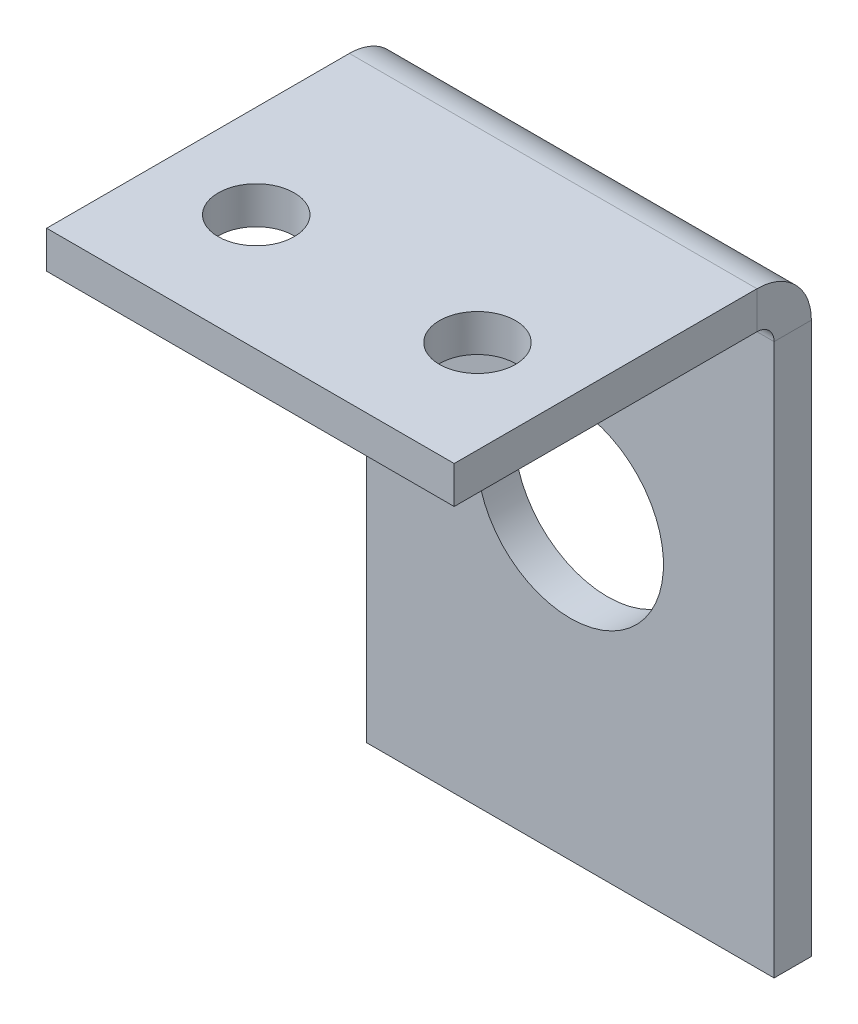
ISO-10303-21;
HEADER;
FILE_DESCRIPTION(('STEP AP214'),'2;1');
FILE_NAME('part.step','',(''),(''),'','','');
FILE_SCHEMA(('AUTOMOTIVE_DESIGN { 1 0 10303 214 1 1 1 1 }'));
ENDSEC;
DATA;
#1=APPLICATION_CONTEXT('core data for automotive mechanical design processes');
#2=APPLICATION_PROTOCOL_DEFINITION('international standard','automotive_design',2000,#1);
#3=PRODUCT_CONTEXT('',#1,'mechanical');
#4=PRODUCT('Part','Part','',(#3));
#5=PRODUCT_RELATED_PRODUCT_CATEGORY('part','',(#4));
#6=PRODUCT_DEFINITION_FORMATION('','',#4);
#7=PRODUCT_DEFINITION_CONTEXT('part definition',#1,'design');
#8=PRODUCT_DEFINITION('design','',#6,#7);
#9=PRODUCT_DEFINITION_SHAPE('','',#8);
#10=(LENGTH_UNIT() NAMED_UNIT(*) SI_UNIT(.MILLI.,.METRE.));
#11=(NAMED_UNIT(*) PLANE_ANGLE_UNIT() SI_UNIT($,.RADIAN.));
#12=(NAMED_UNIT(*) SI_UNIT($,.STERADIAN.) SOLID_ANGLE_UNIT());
#13=UNCERTAINTY_MEASURE_WITH_UNIT(LENGTH_MEASURE(1.E-05),#10,'distance_accuracy_value','');
#14=(GEOMETRIC_REPRESENTATION_CONTEXT(3) GLOBAL_UNCERTAINTY_ASSIGNED_CONTEXT((#13)) GLOBAL_UNIT_ASSIGNED_CONTEXT((#10,
#11,#12)) REPRESENTATION_CONTEXT('',''));
#15=CARTESIAN_POINT('',(0.,0.,0.));
#16=DIRECTION('',(0.,0.,1.));
#17=DIRECTION('',(1.,0.,0.));
#18=AXIS2_PLACEMENT_3D('',#15,#16,#17);
#19=CARTESIAN_POINT('',(0.,0.,0.));
#20=DIRECTION('',(0.,1.,0.));
#21=DIRECTION('',(0.,0.,1.));
#22=AXIS2_PLACEMENT_3D('',#19,#20,#21);
#23=PLANE('',#22);
#24=CARTESIAN_POINT('',(-19.2867132867133,0.,-16.3298368298368));
#25=DIRECTION('',(0.,1.,0.));
#26=DIRECTION('',(0.,0.,1.));
#27=AXIS2_PLACEMENT_3D('',#24,#25,#26);
#28=CIRCLE('',#27,1.63195);
#29=CARTESIAN_POINT('',(-19.2867132867133,0.,-14.6978868298368));
#30=VERTEX_POINT('',#29);
#31=EDGE_CURVE('E222',#30,#30,#28,.F.);
#32=ORIENTED_EDGE('',*,*,#31,.T.);
#33=EDGE_LOOP('',(#32));
#34=FACE_BOUND('',#33,.T.);
#35=DIRECTION('',(0.,0.,1.));
#36=VECTOR('',#35,1.);
#37=CARTESIAN_POINT('',(-23.2867132867133,0.,-21.3298368298368));
#38=LINE('',#37,#36);
#39=CARTESIAN_POINT('',(-23.2867132867133,0.,-24.3298368298368));
#40=VERTEX_POINT('',#39);
#41=CARTESIAN_POINT('',(-23.2867132867133,0.,-11.3298368298368));
#42=VERTEX_POINT('',#41);
#43=EDGE_CURVE('E234',#40,#42,#38,.T.);
#44=ORIENTED_EDGE('',*,*,#43,.T.);
#45=DIRECTION('',(1.,0.,0.));
#46=VECTOR('',#45,1.);
#47=CARTESIAN_POINT('',(-23.2867132867133,0.,-11.3298368298368));
#48=LINE('',#47,#46);
#49=CARTESIAN_POINT('',(-5.78671328671329,0.,-11.3298368298368));
#50=VERTEX_POINT('',#49);
#51=EDGE_CURVE('E249',#42,#50,#48,.T.);
#52=ORIENTED_EDGE('',*,*,#51,.T.);
#53=DIRECTION('',(0.,0.,-1.));
#54=VECTOR('',#53,1.);
#55=CARTESIAN_POINT('',(-5.78671328671329,0.,-21.3298368298368));
#56=LINE('',#55,#54);
#57=CARTESIAN_POINT('',(-5.78671328671329,0.,-24.3298368298368));
#58=VERTEX_POINT('',#57);
#59=EDGE_CURVE('E239',#50,#58,#56,.T.);
#60=ORIENTED_EDGE('',*,*,#59,.T.);
#61=DIRECTION('',(1.,0.,0.));
#62=VECTOR('',#61,1.);
#63=CARTESIAN_POINT('',(-5.78671328671329,0.,-24.3298368298368));
#64=LINE('',#63,#62);
#65=EDGE_CURVE('E192',#58,#40,#64,.F.);
#66=ORIENTED_EDGE('',*,*,#65,.T.);
#67=EDGE_LOOP('',(#44,#52,#60,#66));
#68=FACE_BOUND('',#67,.T.);
#69=CARTESIAN_POINT('',(-9.78671328671328,0.,-16.3298368298368));
#70=DIRECTION('',(0.,1.,0.));
#71=DIRECTION('',(0.,0.,1.));
#72=AXIS2_PLACEMENT_3D('',#69,#70,#71);
#73=CIRCLE('',#72,1.63195);
#74=CARTESIAN_POINT('',(-9.78671328671328,0.,-14.6978868298368));
#75=VERTEX_POINT('',#74);
#76=EDGE_CURVE('E230',#75,#75,#73,.F.);
#77=ORIENTED_EDGE('',*,*,#76,.T.);
#78=EDGE_LOOP('',(#77));
#79=FACE_BOUND('',#78,.T.);
#80=ADVANCED_FACE('F67',(#34,#68,#79),#23,.T.);
#81=CARTESIAN_POINT('',(0.,-1.6,0.));
#82=DIRECTION('',(0.,1.,0.));
#83=DIRECTION('',(0.,0.,1.));
#84=AXIS2_PLACEMENT_3D('',#81,#82,#83);
#85=PLANE('',#84);
#86=CARTESIAN_POINT('',(-19.2867132867133,-1.6,-16.3298368298368));
#87=DIRECTION('',(0.,-1.,0.));
#88=DIRECTION('',(0.,0.,-1.));
#89=AXIS2_PLACEMENT_3D('',#86,#87,#88);
#90=CIRCLE('',#89,1.63195);
#91=CARTESIAN_POINT('',(-19.2867132867133,-1.6,-17.9617868298368));
#92=VERTEX_POINT('',#91);
#93=EDGE_CURVE('E215',#92,#92,#90,.T.);
#94=ORIENTED_EDGE('',*,*,#93,.F.);
#95=EDGE_LOOP('',(#94));
#96=FACE_BOUND('',#95,.T.);
#97=DIRECTION('',(0.,0.,1.));
#98=VECTOR('',#97,1.);
#99=CARTESIAN_POINT('',(-23.2867132867133,-1.6,-21.3298368298368));
#100=LINE('',#99,#98);
#101=CARTESIAN_POINT('',(-23.2867132867133,-1.6,-24.3298368298368));
#102=VERTEX_POINT('',#101);
#103=CARTESIAN_POINT('',(-23.2867132867133,-1.6,-11.3298368298368));
#104=VERTEX_POINT('',#103);
#105=EDGE_CURVE('E235',#102,#104,#100,.T.);
#106=ORIENTED_EDGE('',*,*,#105,.F.);
#107=DIRECTION('',(1.,0.,0.));
#108=VECTOR('',#107,1.);
#109=CARTESIAN_POINT('',(-5.78671328671329,-1.6,-24.3298368298368));
#110=LINE('',#109,#108);
#111=CARTESIAN_POINT('',(-5.78671328671329,-1.6,-24.3298368298368));
#112=VERTEX_POINT('',#111);
#113=EDGE_CURVE('E205',#112,#102,#110,.F.);
#114=ORIENTED_EDGE('',*,*,#113,.F.);
#115=DIRECTION('',(0.,0.,-1.));
#116=VECTOR('',#115,1.);
#117=CARTESIAN_POINT('',(-5.78671328671329,-1.6,-21.3298368298368));
#118=LINE('',#117,#116);
#119=CARTESIAN_POINT('',(-5.78671328671329,-1.6,-11.3298368298368));
#120=VERTEX_POINT('',#119);
#121=EDGE_CURVE('E243',#120,#112,#118,.T.);
#122=ORIENTED_EDGE('',*,*,#121,.F.);
#123=DIRECTION('',(1.,0.,0.));
#124=VECTOR('',#123,1.);
#125=CARTESIAN_POINT('',(-23.2867132867133,-1.6,-11.3298368298368));
#126=LINE('',#125,#124);
#127=EDGE_CURVE('E238',#104,#120,#126,.T.);
#128=ORIENTED_EDGE('',*,*,#127,.F.);
#129=EDGE_LOOP('',(#106,#114,#122,#128));
#130=FACE_BOUND('',#129,.T.);
#131=CARTESIAN_POINT('',(-9.78671328671328,-1.6,-16.3298368298368));
#132=DIRECTION('',(0.,-1.,0.));
#133=DIRECTION('',(0.,0.,-1.));
#134=AXIS2_PLACEMENT_3D('',#131,#132,#133);
#135=CIRCLE('',#134,1.63195);
#136=CARTESIAN_POINT('',(-9.78671328671328,-1.6,-17.9617868298368));
#137=VERTEX_POINT('',#136);
#138=EDGE_CURVE('E226',#137,#137,#135,.T.);
#139=ORIENTED_EDGE('',*,*,#138,.F.);
#140=EDGE_LOOP('',(#139));
#141=FACE_BOUND('',#140,.T.);
#142=ADVANCED_FACE('F278',(#96,#130,#141),#85,.F.);
#143=CARTESIAN_POINT('',(-23.2867132867133,-1.6,-21.3298368298368));
#144=DIRECTION('',(-1.,0.,0.));
#145=DIRECTION('',(0.,0.,1.));
#146=AXIS2_PLACEMENT_3D('',#143,#144,#145);
#147=PLANE('',#146);
#148=ORIENTED_EDGE('',*,*,#43,.F.);
#149=DIRECTION('',(0.,1.,0.));
#150=VECTOR('',#149,1.);
#151=CARTESIAN_POINT('',(-23.2867132867133,-1.6,-24.3298368298368));
#152=LINE('',#151,#150);
#153=EDGE_CURVE('E212',#102,#40,#152,.T.);
#154=ORIENTED_EDGE('',*,*,#153,.F.);
#155=ORIENTED_EDGE('',*,*,#105,.T.);
#156=DIRECTION('',(0.,1.,0.));
#157=VECTOR('',#156,1.);
#158=CARTESIAN_POINT('',(-23.2867132867133,-1.6,-11.3298368298368));
#159=LINE('',#158,#157);
#160=EDGE_CURVE('E71',#104,#42,#159,.T.);
#161=ORIENTED_EDGE('',*,*,#160,.T.);
#162=EDGE_LOOP('',(#148,#154,#155,#161));
#163=FACE_BOUND('',#162,.T.);
#164=ADVANCED_FACE('F69',(#163),#147,.T.);
#165=CARTESIAN_POINT('',(-5.78671328671329,-1.6,-21.3298368298368));
#166=DIRECTION('',(1.,0.,0.));
#167=DIRECTION('',(0.,0.,-1.));
#168=AXIS2_PLACEMENT_3D('',#165,#166,#167);
#169=PLANE('',#168);
#170=ORIENTED_EDGE('',*,*,#59,.F.);
#171=DIRECTION('',(0.,1.,0.));
#172=VECTOR('',#171,1.);
#173=CARTESIAN_POINT('',(-5.78671328671329,-1.6,-11.3298368298368));
#174=LINE('',#173,#172);
#175=EDGE_CURVE('E13',#120,#50,#174,.T.);
#176=ORIENTED_EDGE('',*,*,#175,.F.);
#177=ORIENTED_EDGE('',*,*,#121,.T.);
#178=DIRECTION('',(0.,1.,0.));
#179=VECTOR('',#178,1.);
#180=CARTESIAN_POINT('',(-5.78671328671329,-1.6,-24.3298368298368));
#181=LINE('',#180,#179);
#182=EDGE_CURVE('E198',#112,#58,#181,.T.);
#183=ORIENTED_EDGE('',*,*,#182,.T.);
#184=EDGE_LOOP('',(#170,#176,#177,#183));
#185=FACE_BOUND('',#184,.T.);
#186=ADVANCED_FACE('F257',(#185),#169,.T.);
#187=CARTESIAN_POINT('',(-23.2867132867133,-1.6,-11.3298368298368));
#188=DIRECTION('',(0.,0.,1.));
#189=DIRECTION('',(1.,0.,0.));
#190=AXIS2_PLACEMENT_3D('',#187,#188,#189);
#191=PLANE('',#190);
#192=ORIENTED_EDGE('',*,*,#51,.F.);
#193=ORIENTED_EDGE('',*,*,#160,.F.);
#194=ORIENTED_EDGE('',*,*,#127,.T.);
#195=ORIENTED_EDGE('',*,*,#175,.T.);
#196=EDGE_LOOP('',(#192,#193,#194,#195));
#197=FACE_BOUND('',#196,.T.);
#198=ADVANCED_FACE('F282',(#197),#191,.T.);
#199=CARTESIAN_POINT('',(-9.78671328671328,-1.6,-16.3298368298368));
#200=DIRECTION('',(0.,-1.,0.));
#201=DIRECTION('',(0.,0.,-1.));
#202=AXIS2_PLACEMENT_3D('',#199,#200,#201);
#203=CYLINDRICAL_SURFACE('',#202,1.63195);
#204=ORIENTED_EDGE('',*,*,#76,.F.);
#205=EDGE_LOOP('',(#204));
#206=FACE_BOUND('',#205,.T.);
#207=ORIENTED_EDGE('',*,*,#138,.T.);
#208=EDGE_LOOP('',(#207));
#209=FACE_BOUND('',#208,.T.);
#210=ADVANCED_FACE('F292',(#206,#209),#203,.F.);
#211=CARTESIAN_POINT('',(-19.2867132867133,-1.6,-16.3298368298368));
#212=DIRECTION('',(0.,-1.,0.));
#213=DIRECTION('',(0.,0.,-1.));
#214=AXIS2_PLACEMENT_3D('',#211,#212,#213);
#215=CYLINDRICAL_SURFACE('',#214,1.63195);
#216=ORIENTED_EDGE('',*,*,#31,.F.);
#217=EDGE_LOOP('',(#216));
#218=FACE_BOUND('',#217,.T.);
#219=ORIENTED_EDGE('',*,*,#93,.T.);
#220=EDGE_LOOP('',(#219));
#221=FACE_BOUND('',#220,.T.);
#222=ADVANCED_FACE('F296',(#218,#221),#215,.F.);
#223=CARTESIAN_POINT('',(-23.2867132867133,-2.3366,-24.3298368298368));
#224=DIRECTION('',(-1.,0.,0.));
#225=DIRECTION('',(0.,0.,1.));
#226=AXIS2_PLACEMENT_3D('',#223,#224,#225);
#227=PLANE('',#226);
#228=DIRECTION('',(0.,0.,1.));
#229=VECTOR('',#228,1.);
#230=CARTESIAN_POINT('',(-23.2867132867133,-2.33659999999999,-26.6664368298368));
#231=LINE('',#230,#229);
#232=CARTESIAN_POINT('',(-23.2867132867133,-2.3366,-25.0664368298368));
#233=VERTEX_POINT('',#232);
#234=CARTESIAN_POINT('',(-23.2867132867133,-2.33659999999999,-26.6664368298368));
#235=VERTEX_POINT('',#234);
#236=EDGE_CURVE('E162',#233,#235,#231,.F.);
#237=ORIENTED_EDGE('',*,*,#236,.F.);
#238=CARTESIAN_POINT('',(-23.2867132867133,-2.3366,-24.3298368298368));
#239=DIRECTION('',(1.,0.,0.));
#240=DIRECTION('',(0.,0.,-1.));
#241=AXIS2_PLACEMENT_3D('',#238,#239,#240);
#242=CIRCLE('',#241,0.7366);
#243=EDGE_CURVE('E202',#102,#233,#242,.F.);
#244=ORIENTED_EDGE('',*,*,#243,.F.);
#245=ORIENTED_EDGE('',*,*,#153,.T.);
#246=CARTESIAN_POINT('',(-23.2867132867133,-2.3366,-24.3298368298368));
#247=DIRECTION('',(1.,0.,0.));
#248=DIRECTION('',(0.,0.,-1.));
#249=AXIS2_PLACEMENT_3D('',#246,#247,#248);
#250=CIRCLE('',#249,2.3366);
#251=EDGE_CURVE('E101',#40,#235,#250,.F.);
#252=ORIENTED_EDGE('',*,*,#251,.T.);
#253=EDGE_LOOP('',(#237,#244,#245,#252));
#254=FACE_BOUND('',#253,.T.);
#255=ADVANCED_FACE('F274',(#254),#227,.T.);
#256=CARTESIAN_POINT('',(-5.78671328671329,-2.3366,-24.3298368298368));
#257=DIRECTION('',(-1.,0.,0.));
#258=DIRECTION('',(0.,0.,1.));
#259=AXIS2_PLACEMENT_3D('',#256,#257,#258);
#260=PLANE('',#259);
#261=CARTESIAN_POINT('',(-5.78671328671329,-2.3366,-24.3298368298368));
#262=DIRECTION('',(1.,0.,0.));
#263=DIRECTION('',(0.,0.,-1.));
#264=AXIS2_PLACEMENT_3D('',#261,#262,#263);
#265=CIRCLE('',#264,0.7366);
#266=CARTESIAN_POINT('',(-5.78671328671329,-2.3366,-25.0664368298368));
#267=VERTEX_POINT('',#266);
#268=EDGE_CURVE('E208',#267,#112,#265,.T.);
#269=ORIENTED_EDGE('',*,*,#268,.F.);
#270=DIRECTION('',(0.,0.,1.));
#271=VECTOR('',#270,1.);
#272=CARTESIAN_POINT('',(-5.78671328671329,-2.3366,-25.0664368298368));
#273=LINE('',#272,#271);
#274=CARTESIAN_POINT('',(-5.78671328671329,-2.33659999999999,-26.6664368298368));
#275=VERTEX_POINT('',#274);
#276=EDGE_CURVE('E182',#267,#275,#273,.F.);
#277=ORIENTED_EDGE('',*,*,#276,.T.);
#278=CARTESIAN_POINT('',(-5.78671328671329,-2.3366,-24.3298368298368));
#279=DIRECTION('',(1.,0.,0.));
#280=DIRECTION('',(0.,0.,-1.));
#281=AXIS2_PLACEMENT_3D('',#278,#279,#280);
#282=CIRCLE('',#281,2.3366);
#283=EDGE_CURVE('E195',#275,#58,#282,.T.);
#284=ORIENTED_EDGE('',*,*,#283,.T.);
#285=ORIENTED_EDGE('',*,*,#182,.F.);
#286=EDGE_LOOP('',(#269,#277,#284,#285));
#287=FACE_BOUND('',#286,.T.);
#288=ADVANCED_FACE('F261',(#287),#260,.F.);
#289=CARTESIAN_POINT('',(-5.78671328671329,-2.3366,-24.3298368298368));
#290=DIRECTION('',(1.,0.,0.));
#291=DIRECTION('',(0.,0.,-1.));
#292=AXIS2_PLACEMENT_3D('',#289,#290,#291);
#293=CYLINDRICAL_SURFACE('',#292,2.3366);
#294=ORIENTED_EDGE('',*,*,#65,.F.);
#295=ORIENTED_EDGE('',*,*,#283,.F.);
#296=DIRECTION('',(1.,0.,0.));
#297=VECTOR('',#296,1.);
#298=CARTESIAN_POINT('',(-23.2867132867133,-2.33659999999999,-26.6664368298368));
#299=LINE('',#298,#297);
#300=EDGE_CURVE('E179',#275,#235,#299,.F.);
#301=ORIENTED_EDGE('',*,*,#300,.T.);
#302=ORIENTED_EDGE('',*,*,#251,.F.);
#303=EDGE_LOOP('',(#294,#295,#301,#302));
#304=FACE_BOUND('',#303,.T.);
#305=ADVANCED_FACE('F272',(#304),#293,.T.);
#306=CARTESIAN_POINT('',(-5.78671328671329,-2.3366,-24.3298368298368));
#307=DIRECTION('',(1.,0.,0.));
#308=DIRECTION('',(0.,0.,-1.));
#309=AXIS2_PLACEMENT_3D('',#306,#307,#308);
#310=CYLINDRICAL_SURFACE('',#309,0.7366);
#311=ORIENTED_EDGE('',*,*,#113,.T.);
#312=ORIENTED_EDGE('',*,*,#243,.T.);
#313=DIRECTION('',(1.,0.,0.));
#314=VECTOR('',#313,1.);
#315=CARTESIAN_POINT('',(-23.2867132867133,-2.3366,-25.0664368298368));
#316=LINE('',#315,#314);
#317=EDGE_CURVE('E186',#233,#267,#316,.T.);
#318=ORIENTED_EDGE('',*,*,#317,.T.);
#319=ORIENTED_EDGE('',*,*,#268,.T.);
#320=EDGE_LOOP('',(#311,#312,#318,#319));
#321=FACE_BOUND('',#320,.T.);
#322=ADVANCED_FACE('F264',(#321),#310,.F.);
#323=CARTESIAN_POINT('',(-5.78671328671329,-26.,-26.6664368298369));
#324=DIRECTION('',(-1.,0.,0.));
#325=DIRECTION('',(0.,0.,1.));
#326=AXIS2_PLACEMENT_3D('',#323,#324,#325);
#327=PLANE('',#326);
#328=ORIENTED_EDGE('',*,*,#276,.F.);
#329=DIRECTION('',(0.,1.,0.));
#330=VECTOR('',#329,1.);
#331=CARTESIAN_POINT('',(-5.78671328671329,-26.,-25.0664368298369));
#332=LINE('',#331,#330);
#333=CARTESIAN_POINT('',(-5.78671328671329,-26.,-25.0664368298369));
#334=VERTEX_POINT('',#333);
#335=EDGE_CURVE('E176',#267,#334,#332,.F.);
#336=ORIENTED_EDGE('',*,*,#335,.T.);
#337=DIRECTION('',(0.,0.,1.));
#338=VECTOR('',#337,1.);
#339=CARTESIAN_POINT('',(-5.78671328671329,-26.,-26.6664368298369));
#340=LINE('',#339,#338);
#341=CARTESIAN_POINT('',(-5.78671328671329,-26.,-26.6664368298369));
#342=VERTEX_POINT('',#341);
#343=EDGE_CURVE('E158',#342,#334,#340,.T.);
#344=ORIENTED_EDGE('',*,*,#343,.F.);
#345=DIRECTION('',(0.,-1.,0.));
#346=VECTOR('',#345,1.);
#347=CARTESIAN_POINT('',(-5.78671328671329,0.,-26.6664368298368));
#348=LINE('',#347,#346);
#349=EDGE_CURVE('E143',#275,#342,#348,.T.);
#350=ORIENTED_EDGE('',*,*,#349,.F.);
#351=EDGE_LOOP('',(#328,#336,#344,#350));
#352=FACE_BOUND('',#351,.T.);
#353=ADVANCED_FACE('F271',(#352),#327,.F.);
#354=CARTESIAN_POINT('',(-23.2867132867133,-1.59999999999999,-26.6664368298368));
#355=DIRECTION('',(1.,0.,0.));
#356=DIRECTION('',(0.,0.,-1.));
#357=AXIS2_PLACEMENT_3D('',#354,#355,#356);
#358=PLANE('',#357);
#359=ORIENTED_EDGE('',*,*,#236,.T.);
#360=DIRECTION('',(0.,1.,0.));
#361=VECTOR('',#360,1.);
#362=CARTESIAN_POINT('',(-23.2867132867133,0.,-26.6664368298368));
#363=LINE('',#362,#361);
#364=CARTESIAN_POINT('',(-23.2867132867133,-26.,-26.6664368298369));
#365=VERTEX_POINT('',#364);
#366=EDGE_CURVE('E141',#365,#235,#363,.T.);
#367=ORIENTED_EDGE('',*,*,#366,.F.);
#368=DIRECTION('',(0.,0.,1.));
#369=VECTOR('',#368,1.);
#370=CARTESIAN_POINT('',(-23.2867132867133,-26.,-26.6664368298369));
#371=LINE('',#370,#369);
#372=CARTESIAN_POINT('',(-23.2867132867133,-26.,-25.0664368298369));
#373=VERTEX_POINT('',#372);
#374=EDGE_CURVE('E150',#365,#373,#371,.T.);
#375=ORIENTED_EDGE('',*,*,#374,.T.);
#376=DIRECTION('',(0.,-1.,0.));
#377=VECTOR('',#376,1.);
#378=CARTESIAN_POINT('',(-23.2867132867133,-1.6,-25.0664368298368));
#379=LINE('',#378,#377);
#380=EDGE_CURVE('E171',#373,#233,#379,.F.);
#381=ORIENTED_EDGE('',*,*,#380,.T.);
#382=EDGE_LOOP('',(#359,#367,#375,#381));
#383=FACE_BOUND('',#382,.T.);
#384=ADVANCED_FACE('F161',(#383),#358,.F.);
#385=CARTESIAN_POINT('',(0.,0.,-26.6664368298368));
#386=DIRECTION('',(0.,0.,1.));
#387=DIRECTION('',(0.,-1.,0.));
#388=AXIS2_PLACEMENT_3D('',#385,#386,#387);
#389=PLANE('',#388);
#390=CARTESIAN_POINT('',(-14.5367132867133,-12.9999999999999,-26.6664368298369));
#391=DIRECTION('',(0.,0.,-1.));
#392=DIRECTION('',(0.,1.,0.));
#393=AXIS2_PLACEMENT_3D('',#390,#391,#392);
#394=CIRCLE('',#393,4.);
#395=CARTESIAN_POINT('',(-14.5367132867133,-8.99999999999994,-26.6664368298369));
#396=VERTEX_POINT('',#395);
#397=EDGE_CURVE('E337',#396,#396,#394,.T.);
#398=ORIENTED_EDGE('',*,*,#397,.F.);
#399=EDGE_LOOP('',(#398));
#400=FACE_BOUND('',#399,.T.);
#401=ORIENTED_EDGE('',*,*,#300,.F.);
#402=ORIENTED_EDGE('',*,*,#349,.T.);
#403=DIRECTION('',(-1.,0.,0.));
#404=VECTOR('',#403,1.);
#405=CARTESIAN_POINT('',(0.,-26.,-26.6664368298369));
#406=LINE('',#405,#404);
#407=EDGE_CURVE('E136',#342,#365,#406,.T.);
#408=ORIENTED_EDGE('',*,*,#407,.T.);
#409=ORIENTED_EDGE('',*,*,#366,.T.);
#410=EDGE_LOOP('',(#401,#402,#408,#409));
#411=FACE_BOUND('',#410,.T.);
#412=ADVANCED_FACE('F139',(#400,#411),#389,.F.);
#413=CARTESIAN_POINT('',(0.,0.,-25.0664368298368));
#414=DIRECTION('',(0.,0.,1.));
#415=DIRECTION('',(0.,-1.,0.));
#416=AXIS2_PLACEMENT_3D('',#413,#414,#415);
#417=PLANE('',#416);
#418=CARTESIAN_POINT('',(-14.5367132867133,-12.9999999999999,-25.0664368298369));
#419=DIRECTION('',(0.,0.,1.));
#420=DIRECTION('',(0.,-1.,0.));
#421=AXIS2_PLACEMENT_3D('',#418,#419,#420);
#422=CIRCLE('',#421,4.);
#423=CARTESIAN_POINT('',(-14.5367132867133,-16.9999999999999,-25.0664368298369));
#424=VERTEX_POINT('',#423);
#425=EDGE_CURVE('E191',#424,#424,#422,.F.);
#426=ORIENTED_EDGE('',*,*,#425,.T.);
#427=EDGE_LOOP('',(#426));
#428=FACE_BOUND('',#427,.T.);
#429=ORIENTED_EDGE('',*,*,#335,.F.);
#430=ORIENTED_EDGE('',*,*,#317,.F.);
#431=ORIENTED_EDGE('',*,*,#380,.F.);
#432=DIRECTION('',(1.,0.,0.));
#433=VECTOR('',#432,1.);
#434=CARTESIAN_POINT('',(-23.2867132867133,-26.,-25.0664368298369));
#435=LINE('',#434,#433);
#436=EDGE_CURVE('E153',#334,#373,#435,.F.);
#437=ORIENTED_EDGE('',*,*,#436,.F.);
#438=EDGE_LOOP('',(#429,#430,#431,#437));
#439=FACE_BOUND('',#438,.T.);
#440=ADVANCED_FACE('F269',(#428,#439),#417,.T.);
#441=CARTESIAN_POINT('',(-23.2867132867133,-26.,-26.6664368298369));
#442=DIRECTION('',(0.,1.,0.));
#443=DIRECTION('',(0.,0.,1.));
#444=AXIS2_PLACEMENT_3D('',#441,#442,#443);
#445=PLANE('',#444);
#446=ORIENTED_EDGE('',*,*,#436,.T.);
#447=ORIENTED_EDGE('',*,*,#374,.F.);
#448=ORIENTED_EDGE('',*,*,#407,.F.);
#449=ORIENTED_EDGE('',*,*,#343,.T.);
#450=EDGE_LOOP('',(#446,#447,#448,#449));
#451=FACE_BOUND('',#450,.T.);
#452=ADVANCED_FACE('F151',(#451),#445,.F.);
#453=CARTESIAN_POINT('',(-14.5367132867133,-13.,-13.7527283308521));
#454=DIRECTION('',(0.,0.,-1.));
#455=DIRECTION('',(0.,1.,0.));
#456=AXIS2_PLACEMENT_3D('',#453,#454,#455);
#457=CYLINDRICAL_SURFACE('',#456,4.);
#458=ORIENTED_EDGE('',*,*,#397,.T.);
#459=EDGE_LOOP('',(#458));
#460=FACE_BOUND('',#459,.T.);
#461=ORIENTED_EDGE('',*,*,#425,.F.);
#462=EDGE_LOOP('',(#461));
#463=FACE_BOUND('',#462,.T.);
#464=ADVANCED_FACE('F322',(#460,#463),#457,.F.);
#465=CLOSED_SHELL('',(#80,#142,#164,#186,#198,#210,#222,#255,#288,#305,#322,#353,#384,#412,#440,
#452,#464));
#466=MANIFOLD_SOLID_BREP('B2',#465);
#467=ADVANCED_BREP_SHAPE_REPRESENTATION('',(#18,#466),#14);
#468=SHAPE_DEFINITION_REPRESENTATION(#9,#467);
ENDSEC;
END-ISO-10303-21;
